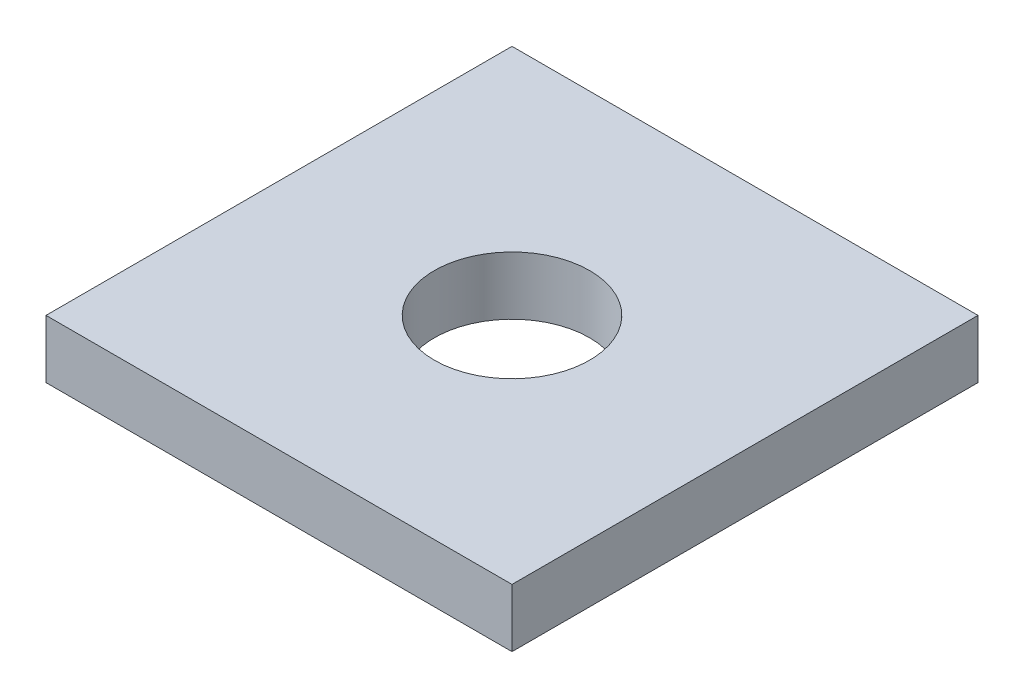
ISO-10303-21;
HEADER;
FILE_DESCRIPTION(('STEP AP214'),'2;1');
FILE_NAME('part.step','',(''),(''),'','','');
FILE_SCHEMA(('AUTOMOTIVE_DESIGN { 1 0 10303 214 1 1 1 1 }'));
ENDSEC;
DATA;
#1=APPLICATION_CONTEXT('core data for automotive mechanical design processes');
#2=APPLICATION_PROTOCOL_DEFINITION('international standard','automotive_design',2000,#1);
#3=PRODUCT_CONTEXT('',#1,'mechanical');
#4=PRODUCT('Part','Part','',(#3));
#5=PRODUCT_RELATED_PRODUCT_CATEGORY('part','',(#4));
#6=PRODUCT_DEFINITION_FORMATION('','',#4);
#7=PRODUCT_DEFINITION_CONTEXT('part definition',#1,'design');
#8=PRODUCT_DEFINITION('design','',#6,#7);
#9=PRODUCT_DEFINITION_SHAPE('','',#8);
#10=(LENGTH_UNIT() NAMED_UNIT(*) SI_UNIT(.MILLI.,.METRE.));
#11=(NAMED_UNIT(*) PLANE_ANGLE_UNIT() SI_UNIT($,.RADIAN.));
#12=(NAMED_UNIT(*) SI_UNIT($,.STERADIAN.) SOLID_ANGLE_UNIT());
#13=UNCERTAINTY_MEASURE_WITH_UNIT(LENGTH_MEASURE(1.E-05),#10,'distance_accuracy_value','');
#14=(GEOMETRIC_REPRESENTATION_CONTEXT(3) GLOBAL_UNCERTAINTY_ASSIGNED_CONTEXT((#13)) GLOBAL_UNIT_ASSIGNED_CONTEXT((#10,
#11,#12)) REPRESENTATION_CONTEXT('',''));
#15=CARTESIAN_POINT('',(0.,0.,0.));
#16=DIRECTION('',(0.,0.,1.));
#17=DIRECTION('',(1.,0.,0.));
#18=AXIS2_PLACEMENT_3D('',#15,#16,#17);
#19=CARTESIAN_POINT('',(0.,1.5,0.));
#20=DIRECTION('',(0.,-1.,0.));
#21=DIRECTION('',(0.,0.,-1.));
#22=AXIS2_PLACEMENT_3D('',#19,#20,#21);
#23=PLANE('',#22);
#24=DIRECTION('',(0.,0.,1.));
#25=VECTOR('',#24,1.);
#26=CARTESIAN_POINT('',(0.,1.5,0.));
#27=LINE('',#26,#25);
#28=CARTESIAN_POINT('',(0.,1.5,-12.));
#29=VERTEX_POINT('',#28);
#30=CARTESIAN_POINT('',(0.,1.5,0.));
#31=VERTEX_POINT('',#30);
#32=EDGE_CURVE('E84',#29,#31,#27,.T.);
#33=ORIENTED_EDGE('',*,*,#32,.T.);
#34=DIRECTION('',(1.,0.,0.));
#35=VECTOR('',#34,1.);
#36=CARTESIAN_POINT('',(0.,1.5,0.));
#37=LINE('',#36,#35);
#38=CARTESIAN_POINT('',(12.,1.5,0.));
#39=VERTEX_POINT('',#38);
#40=EDGE_CURVE('E79',#31,#39,#37,.T.);
#41=ORIENTED_EDGE('',*,*,#40,.T.);
#42=DIRECTION('',(0.,0.,-1.));
#43=VECTOR('',#42,1.);
#44=CARTESIAN_POINT('',(12.,1.5,0.));
#45=LINE('',#44,#43);
#46=CARTESIAN_POINT('',(12.,1.5,-12.));
#47=VERTEX_POINT('',#46);
#48=EDGE_CURVE('E82',#39,#47,#45,.T.);
#49=ORIENTED_EDGE('',*,*,#48,.T.);
#50=DIRECTION('',(-1.,0.,0.));
#51=VECTOR('',#50,1.);
#52=CARTESIAN_POINT('',(0.,1.5,-12.));
#53=LINE('',#52,#51);
#54=EDGE_CURVE('E49',#47,#29,#53,.T.);
#55=ORIENTED_EDGE('',*,*,#54,.T.);
#56=EDGE_LOOP('',(#33,#41,#49,#55));
#57=FACE_BOUND('',#56,.T.);
#58=CARTESIAN_POINT('',(6.,1.5,-6.));
#59=DIRECTION('',(0.,1.,0.));
#60=DIRECTION('',(0.,0.,1.));
#61=AXIS2_PLACEMENT_3D('',#58,#59,#60);
#62=CIRCLE('',#61,2.);
#63=CARTESIAN_POINT('',(6.,1.5,-4.));
#64=VERTEX_POINT('',#63);
#65=EDGE_CURVE('E99',#64,#64,#62,.T.);
#66=ORIENTED_EDGE('',*,*,#65,.F.);
#67=EDGE_LOOP('',(#66));
#68=FACE_BOUND('',#67,.T.);
#69=ADVANCED_FACE('F32',(#57,#68),#23,.F.);
#70=CARTESIAN_POINT('',(0.,0.,0.));
#71=DIRECTION('',(0.,-1.,0.));
#72=DIRECTION('',(0.,0.,-1.));
#73=AXIS2_PLACEMENT_3D('',#70,#71,#72);
#74=PLANE('',#73);
#75=DIRECTION('',(0.,0.,1.));
#76=VECTOR('',#75,1.);
#77=CARTESIAN_POINT('',(0.,0.,0.));
#78=LINE('',#77,#76);
#79=CARTESIAN_POINT('',(0.,0.,-12.));
#80=VERTEX_POINT('',#79);
#81=CARTESIAN_POINT('',(0.,0.,0.));
#82=VERTEX_POINT('',#81);
#83=EDGE_CURVE('E96',#80,#82,#78,.T.);
#84=ORIENTED_EDGE('',*,*,#83,.F.);
#85=DIRECTION('',(-1.,0.,0.));
#86=VECTOR('',#85,1.);
#87=CARTESIAN_POINT('',(0.,0.,-12.));
#88=LINE('',#87,#86);
#89=CARTESIAN_POINT('',(12.,0.,-12.));
#90=VERTEX_POINT('',#89);
#91=EDGE_CURVE('E72',#90,#80,#88,.T.);
#92=ORIENTED_EDGE('',*,*,#91,.F.);
#93=DIRECTION('',(0.,0.,-1.));
#94=VECTOR('',#93,1.);
#95=CARTESIAN_POINT('',(12.,0.,0.));
#96=LINE('',#95,#94);
#97=CARTESIAN_POINT('',(12.,0.,0.));
#98=VERTEX_POINT('',#97);
#99=EDGE_CURVE('E66',#98,#90,#96,.T.);
#100=ORIENTED_EDGE('',*,*,#99,.F.);
#101=DIRECTION('',(1.,0.,0.));
#102=VECTOR('',#101,1.);
#103=CARTESIAN_POINT('',(0.,0.,0.));
#104=LINE('',#103,#102);
#105=EDGE_CURVE('E88',#82,#98,#104,.T.);
#106=ORIENTED_EDGE('',*,*,#105,.F.);
#107=EDGE_LOOP('',(#84,#92,#100,#106));
#108=FACE_BOUND('',#107,.T.);
#109=CARTESIAN_POINT('',(6.,0.,-6.));
#110=DIRECTION('',(0.,1.,0.));
#111=DIRECTION('',(0.,0.,1.));
#112=AXIS2_PLACEMENT_3D('',#109,#110,#111);
#113=CIRCLE('',#112,2.);
#114=CARTESIAN_POINT('',(6.,0.,-4.));
#115=VERTEX_POINT('',#114);
#116=EDGE_CURVE('E111',#115,#115,#113,.T.);
#117=ORIENTED_EDGE('',*,*,#116,.T.);
#118=EDGE_LOOP('',(#117));
#119=FACE_BOUND('',#118,.T.);
#120=ADVANCED_FACE('F107',(#108,#119),#74,.T.);
#121=CARTESIAN_POINT('',(0.,1.5,0.));
#122=DIRECTION('',(1.,0.,0.));
#123=DIRECTION('',(0.,0.,-1.));
#124=AXIS2_PLACEMENT_3D('',#121,#122,#123);
#125=PLANE('',#124);
#126=ORIENTED_EDGE('',*,*,#83,.T.);
#127=DIRECTION('',(0.,-1.,0.));
#128=VECTOR('',#127,1.);
#129=CARTESIAN_POINT('',(0.,1.5,0.));
#130=LINE('',#129,#128);
#131=EDGE_CURVE('E11',#31,#82,#130,.T.);
#132=ORIENTED_EDGE('',*,*,#131,.F.);
#133=ORIENTED_EDGE('',*,*,#32,.F.);
#134=DIRECTION('',(0.,-1.,0.));
#135=VECTOR('',#134,1.);
#136=CARTESIAN_POINT('',(0.,1.5,-12.));
#137=LINE('',#136,#135);
#138=EDGE_CURVE('E92',#29,#80,#137,.T.);
#139=ORIENTED_EDGE('',*,*,#138,.T.);
#140=EDGE_LOOP('',(#126,#132,#133,#139));
#141=FACE_BOUND('',#140,.T.);
#142=ADVANCED_FACE('F34',(#141),#125,.F.);
#143=CARTESIAN_POINT('',(0.,1.5,0.));
#144=DIRECTION('',(0.,0.,-1.));
#145=DIRECTION('',(-1.,0.,0.));
#146=AXIS2_PLACEMENT_3D('',#143,#144,#145);
#147=PLANE('',#146);
#148=ORIENTED_EDGE('',*,*,#105,.T.);
#149=DIRECTION('',(0.,-1.,0.));
#150=VECTOR('',#149,1.);
#151=CARTESIAN_POINT('',(12.,1.5,0.));
#152=LINE('',#151,#150);
#153=EDGE_CURVE('E41',#39,#98,#152,.T.);
#154=ORIENTED_EDGE('',*,*,#153,.F.);
#155=ORIENTED_EDGE('',*,*,#40,.F.);
#156=ORIENTED_EDGE('',*,*,#131,.T.);
#157=EDGE_LOOP('',(#148,#154,#155,#156));
#158=FACE_BOUND('',#157,.T.);
#159=ADVANCED_FACE('F87',(#158),#147,.F.);
#160=CARTESIAN_POINT('',(12.,1.5,0.));
#161=DIRECTION('',(-1.,0.,0.));
#162=DIRECTION('',(0.,0.,1.));
#163=AXIS2_PLACEMENT_3D('',#160,#161,#162);
#164=PLANE('',#163);
#165=ORIENTED_EDGE('',*,*,#99,.T.);
#166=DIRECTION('',(0.,-1.,0.));
#167=VECTOR('',#166,1.);
#168=CARTESIAN_POINT('',(12.,1.5,-12.));
#169=LINE('',#168,#167);
#170=EDGE_CURVE('E89',#47,#90,#169,.T.);
#171=ORIENTED_EDGE('',*,*,#170,.F.);
#172=ORIENTED_EDGE('',*,*,#48,.F.);
#173=ORIENTED_EDGE('',*,*,#153,.T.);
#174=EDGE_LOOP('',(#165,#171,#172,#173));
#175=FACE_BOUND('',#174,.T.);
#176=ADVANCED_FACE('F90',(#175),#164,.F.);
#177=CARTESIAN_POINT('',(0.,1.5,-12.));
#178=DIRECTION('',(0.,0.,1.));
#179=DIRECTION('',(1.,0.,0.));
#180=AXIS2_PLACEMENT_3D('',#177,#178,#179);
#181=PLANE('',#180);
#182=ORIENTED_EDGE('',*,*,#91,.T.);
#183=ORIENTED_EDGE('',*,*,#138,.F.);
#184=ORIENTED_EDGE('',*,*,#54,.F.);
#185=ORIENTED_EDGE('',*,*,#170,.T.);
#186=EDGE_LOOP('',(#182,#183,#184,#185));
#187=FACE_BOUND('',#186,.T.);
#188=ADVANCED_FACE('F104',(#187),#181,.F.);
#189=CARTESIAN_POINT('',(6.,1.5,-6.));
#190=DIRECTION('',(0.,-1.,0.));
#191=DIRECTION('',(0.,0.,-1.));
#192=AXIS2_PLACEMENT_3D('',#189,#190,#191);
#193=CYLINDRICAL_SURFACE('',#192,2.);
#194=ORIENTED_EDGE('',*,*,#65,.T.);
#195=EDGE_LOOP('',(#194));
#196=FACE_BOUND('',#195,.T.);
#197=ORIENTED_EDGE('',*,*,#116,.F.);
#198=EDGE_LOOP('',(#197));
#199=FACE_BOUND('',#198,.T.);
#200=ADVANCED_FACE('F117',(#196,#199),#193,.F.);
#201=CLOSED_SHELL('',(#69,#120,#142,#159,#176,#188,#200));
#202=MANIFOLD_SOLID_BREP('B2',#201);
#203=ADVANCED_BREP_SHAPE_REPRESENTATION('',(#18,#202),#14);
#204=SHAPE_DEFINITION_REPRESENTATION(#9,#203);
ENDSEC;
END-ISO-10303-21;
